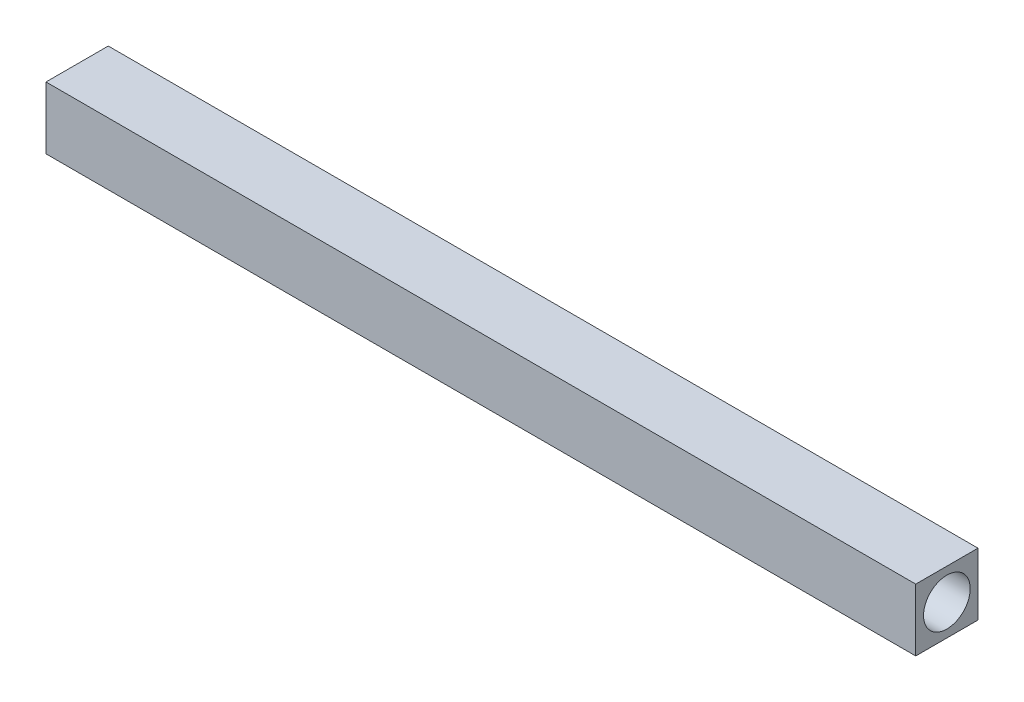
ISO-10303-21;
HEADER;
FILE_DESCRIPTION(('STEP AP214'),'2;1');
FILE_NAME('part.step','',(''),(''),'','','');
FILE_SCHEMA(('AUTOMOTIVE_DESIGN { 1 0 10303 214 1 1 1 1 }'));
ENDSEC;
DATA;
#1=APPLICATION_CONTEXT('core data for automotive mechanical design processes');
#2=APPLICATION_PROTOCOL_DEFINITION('international standard','automotive_design',2000,#1);
#3=PRODUCT_CONTEXT('',#1,'mechanical');
#4=PRODUCT('Part','Part','',(#3));
#5=PRODUCT_RELATED_PRODUCT_CATEGORY('part','',(#4));
#6=PRODUCT_DEFINITION_FORMATION('','',#4);
#7=PRODUCT_DEFINITION_CONTEXT('part definition',#1,'design');
#8=PRODUCT_DEFINITION('design','',#6,#7);
#9=PRODUCT_DEFINITION_SHAPE('','',#8);
#10=(LENGTH_UNIT() NAMED_UNIT(*) SI_UNIT(.MILLI.,.METRE.));
#11=(NAMED_UNIT(*) PLANE_ANGLE_UNIT() SI_UNIT($,.RADIAN.));
#12=(NAMED_UNIT(*) SI_UNIT($,.STERADIAN.) SOLID_ANGLE_UNIT());
#13=UNCERTAINTY_MEASURE_WITH_UNIT(LENGTH_MEASURE(1.E-05),#10,'distance_accuracy_value','');
#14=(GEOMETRIC_REPRESENTATION_CONTEXT(3) GLOBAL_UNCERTAINTY_ASSIGNED_CONTEXT((#13)) GLOBAL_UNIT_ASSIGNED_CONTEXT((#10,
#11,#12)) REPRESENTATION_CONTEXT('',''));
#15=CARTESIAN_POINT('',(0.,0.,0.));
#16=DIRECTION('',(0.,0.,1.));
#17=DIRECTION('',(1.,0.,0.));
#18=AXIS2_PLACEMENT_3D('',#15,#16,#17);
#19=CARTESIAN_POINT('',(279.4,0.,0.));
#20=DIRECTION('',(0.,0.,1.));
#21=DIRECTION('',(1.,0.,0.));
#22=AXIS2_PLACEMENT_3D('',#19,#20,#21);
#23=PLANE('',#22);
#24=DIRECTION('',(0.,1.,0.));
#25=VECTOR('',#24,1.);
#26=CARTESIAN_POINT('',(0.,0.,0.));
#27=LINE('',#26,#25);
#28=CARTESIAN_POINT('',(0.,0.,0.));
#29=VERTEX_POINT('',#28);
#30=CARTESIAN_POINT('',(0.,20.,0.));
#31=VERTEX_POINT('',#30);
#32=EDGE_CURVE('E99',#29,#31,#27,.T.);
#33=ORIENTED_EDGE('',*,*,#32,.T.);
#34=DIRECTION('',(-1.,0.,0.));
#35=VECTOR('',#34,1.);
#36=CARTESIAN_POINT('',(279.4,20.,0.));
#37=LINE('',#36,#35);
#38=CARTESIAN_POINT('',(279.4,20.,0.));
#39=VERTEX_POINT('',#38);
#40=EDGE_CURVE('E41',#39,#31,#37,.T.);
#41=ORIENTED_EDGE('',*,*,#40,.F.);
#42=DIRECTION('',(0.,1.,0.));
#43=VECTOR('',#42,1.);
#44=CARTESIAN_POINT('',(279.4,0.,0.));
#45=LINE('',#44,#43);
#46=CARTESIAN_POINT('',(279.4,0.,0.));
#47=VERTEX_POINT('',#46);
#48=EDGE_CURVE('E85',#47,#39,#45,.T.);
#49=ORIENTED_EDGE('',*,*,#48,.F.);
#50=DIRECTION('',(-1.,0.,0.));
#51=VECTOR('',#50,1.);
#52=CARTESIAN_POINT('',(279.4,0.,0.));
#53=LINE('',#52,#51);
#54=EDGE_CURVE('E95',#47,#29,#53,.T.);
#55=ORIENTED_EDGE('',*,*,#54,.T.);
#56=EDGE_LOOP('',(#33,#41,#49,#55));
#57=FACE_BOUND('',#56,.T.);
#58=CARTESIAN_POINT('',(10.,10.,0.));
#59=DIRECTION('',(0.,0.,1.));
#60=DIRECTION('',(1.,0.,0.));
#61=AXIS2_PLACEMENT_3D('',#58,#59,#60);
#62=CIRCLE('',#61,7.5);
#63=CARTESIAN_POINT('',(17.5,10.,0.));
#64=VERTEX_POINT('',#63);
#65=EDGE_CURVE('E11',#64,#64,#62,.F.);
#66=ORIENTED_EDGE('',*,*,#65,.F.);
#67=EDGE_LOOP('',(#66));
#68=FACE_BOUND('',#67,.T.);
#69=ADVANCED_FACE('F33',(#57,#68),#23,.F.);
#70=CARTESIAN_POINT('',(279.4,20.,0.));
#71=DIRECTION('',(0.,-1.,0.));
#72=DIRECTION('',(0.,0.,-1.));
#73=AXIS2_PLACEMENT_3D('',#70,#71,#72);
#74=PLANE('',#73);
#75=DIRECTION('',(0.,0.,1.));
#76=VECTOR('',#75,1.);
#77=CARTESIAN_POINT('',(0.,20.,0.));
#78=LINE('',#77,#76);
#79=CARTESIAN_POINT('',(0.,20.,20.));
#80=VERTEX_POINT('',#79);
#81=EDGE_CURVE('E90',#31,#80,#78,.T.);
#82=ORIENTED_EDGE('',*,*,#81,.T.);
#83=DIRECTION('',(-1.,0.,0.));
#84=VECTOR('',#83,1.);
#85=CARTESIAN_POINT('',(279.4,20.,20.));
#86=LINE('',#85,#84);
#87=CARTESIAN_POINT('',(279.4,20.,20.));
#88=VERTEX_POINT('',#87);
#89=EDGE_CURVE('E88',#88,#80,#86,.T.);
#90=ORIENTED_EDGE('',*,*,#89,.F.);
#91=DIRECTION('',(0.,0.,1.));
#92=VECTOR('',#91,1.);
#93=CARTESIAN_POINT('',(279.4,20.,0.));
#94=LINE('',#93,#92);
#95=EDGE_CURVE('E80',#39,#88,#94,.T.);
#96=ORIENTED_EDGE('',*,*,#95,.F.);
#97=ORIENTED_EDGE('',*,*,#40,.T.);
#98=EDGE_LOOP('',(#82,#90,#96,#97));
#99=FACE_BOUND('',#98,.T.);
#100=ADVANCED_FACE('F89',(#99),#74,.F.);
#101=CARTESIAN_POINT('',(279.4,0.,20.));
#102=DIRECTION('',(0.,0.,-1.));
#103=DIRECTION('',(-1.,0.,0.));
#104=AXIS2_PLACEMENT_3D('',#101,#102,#103);
#105=PLANE('',#104);
#106=DIRECTION('',(0.,-1.,0.));
#107=VECTOR('',#106,1.);
#108=CARTESIAN_POINT('',(0.,0.,20.));
#109=LINE('',#108,#107);
#110=CARTESIAN_POINT('',(0.,0.,20.));
#111=VERTEX_POINT('',#110);
#112=EDGE_CURVE('E66',#80,#111,#109,.T.);
#113=ORIENTED_EDGE('',*,*,#112,.T.);
#114=DIRECTION('',(-1.,0.,0.));
#115=VECTOR('',#114,1.);
#116=CARTESIAN_POINT('',(279.4,0.,20.));
#117=LINE('',#116,#115);
#118=CARTESIAN_POINT('',(279.4,0.,20.));
#119=VERTEX_POINT('',#118);
#120=EDGE_CURVE('E91',#119,#111,#117,.T.);
#121=ORIENTED_EDGE('',*,*,#120,.F.);
#122=DIRECTION('',(0.,-1.,0.));
#123=VECTOR('',#122,1.);
#124=CARTESIAN_POINT('',(279.4,0.,20.));
#125=LINE('',#124,#123);
#126=EDGE_CURVE('E83',#88,#119,#125,.T.);
#127=ORIENTED_EDGE('',*,*,#126,.F.);
#128=ORIENTED_EDGE('',*,*,#89,.T.);
#129=EDGE_LOOP('',(#113,#121,#127,#128));
#130=FACE_BOUND('',#129,.T.);
#131=ADVANCED_FACE('F93',(#130),#105,.F.);
#132=CARTESIAN_POINT('',(279.4,0.,0.));
#133=DIRECTION('',(0.,1.,0.));
#134=DIRECTION('',(0.,0.,1.));
#135=AXIS2_PLACEMENT_3D('',#132,#133,#134);
#136=PLANE('',#135);
#137=DIRECTION('',(0.,0.,-1.));
#138=VECTOR('',#137,1.);
#139=CARTESIAN_POINT('',(0.,0.,0.));
#140=LINE('',#139,#138);
#141=EDGE_CURVE('E72',#111,#29,#140,.T.);
#142=ORIENTED_EDGE('',*,*,#141,.T.);
#143=ORIENTED_EDGE('',*,*,#54,.F.);
#144=DIRECTION('',(0.,0.,-1.));
#145=VECTOR('',#144,1.);
#146=CARTESIAN_POINT('',(279.4,0.,0.));
#147=LINE('',#146,#145);
#148=EDGE_CURVE('E49',#119,#47,#147,.T.);
#149=ORIENTED_EDGE('',*,*,#148,.F.);
#150=ORIENTED_EDGE('',*,*,#120,.T.);
#151=EDGE_LOOP('',(#142,#143,#149,#150));
#152=FACE_BOUND('',#151,.T.);
#153=ADVANCED_FACE('F122',(#152),#136,.F.);
#154=CARTESIAN_POINT('',(279.4,20.,0.));
#155=DIRECTION('',(1.,0.,0.));
#156=DIRECTION('',(0.,0.,-1.));
#157=AXIS2_PLACEMENT_3D('',#154,#155,#156);
#158=PLANE('',#157);
#159=CARTESIAN_POINT('',(279.4,9.99999999999999,10.));
#160=DIRECTION('',(1.,0.,0.));
#161=DIRECTION('',(0.,0.,-1.));
#162=AXIS2_PLACEMENT_3D('',#159,#160,#161);
#163=CIRCLE('',#162,7.5);
#164=CARTESIAN_POINT('',(279.4,9.99999999999999,2.5));
#165=VERTEX_POINT('',#164);
#166=EDGE_CURVE('E184',#165,#165,#163,.T.);
#167=ORIENTED_EDGE('',*,*,#166,.F.);
#168=EDGE_LOOP('',(#167));
#169=FACE_BOUND('',#168,.T.);
#170=ORIENTED_EDGE('',*,*,#48,.T.);
#171=ORIENTED_EDGE('',*,*,#95,.T.);
#172=ORIENTED_EDGE('',*,*,#126,.T.);
#173=ORIENTED_EDGE('',*,*,#148,.T.);
#174=EDGE_LOOP('',(#170,#171,#172,#173));
#175=FACE_BOUND('',#174,.T.);
#176=ADVANCED_FACE('F81',(#169,#175),#158,.T.);
#177=CARTESIAN_POINT('',(0.,20.,0.));
#178=DIRECTION('',(1.,0.,0.));
#179=DIRECTION('',(0.,0.,-1.));
#180=AXIS2_PLACEMENT_3D('',#177,#178,#179);
#181=PLANE('',#180);
#182=ORIENTED_EDGE('',*,*,#32,.F.);
#183=ORIENTED_EDGE('',*,*,#141,.F.);
#184=ORIENTED_EDGE('',*,*,#112,.F.);
#185=ORIENTED_EDGE('',*,*,#81,.F.);
#186=EDGE_LOOP('',(#182,#183,#184,#185));
#187=FACE_BOUND('',#186,.T.);
#188=ADVANCED_FACE('F111',(#187),#181,.F.);
#189=CARTESIAN_POINT('',(10.,10.,-1.5));
#190=DIRECTION('',(0.,0.,1.));
#191=DIRECTION('',(1.,0.,0.));
#192=AXIS2_PLACEMENT_3D('',#189,#190,#191);
#193=CYLINDRICAL_SURFACE('',#192,7.5);
#194=CARTESIAN_POINT('',(10.,10.,-1.5));
#195=DIRECTION('',(0.,0.,-1.));
#196=DIRECTION('',(-1.,0.,0.));
#197=AXIS2_PLACEMENT_3D('',#194,#195,#196);
#198=CIRCLE('',#197,7.5);
#199=CARTESIAN_POINT('',(2.5,10.,-1.5));
#200=VERTEX_POINT('',#199);
#201=EDGE_CURVE('E102',#200,#200,#198,.T.);
#202=ORIENTED_EDGE('',*,*,#201,.F.);
#203=EDGE_LOOP('',(#202));
#204=FACE_BOUND('',#203,.T.);
#205=ORIENTED_EDGE('',*,*,#65,.T.);
#206=EDGE_LOOP('',(#205));
#207=FACE_BOUND('',#206,.T.);
#208=ADVANCED_FACE('F113',(#204,#207),#193,.T.);
#209=CARTESIAN_POINT('',(10.,10.,-1.5));
#210=DIRECTION('',(0.,0.,-1.));
#211=DIRECTION('',(-1.,0.,0.));
#212=AXIS2_PLACEMENT_3D('',#209,#210,#211);
#213=PLANE('',#212);
#214=ORIENTED_EDGE('',*,*,#201,.T.);
#215=EDGE_LOOP('',(#214));
#216=FACE_BOUND('',#215,.T.);
#217=ADVANCED_FACE('F119',(#216),#213,.T.);
#218=CARTESIAN_POINT('',(12.7,9.99999999999999,10.));
#219=DIRECTION('',(1.,0.,0.));
#220=DIRECTION('',(0.,0.,-1.));
#221=AXIS2_PLACEMENT_3D('',#218,#219,#220);
#222=CYLINDRICAL_SURFACE('',#221,7.5);
#223=CARTESIAN_POINT('',(12.7,9.99999999999999,10.));
#224=DIRECTION('',(1.,0.,0.));
#225=DIRECTION('',(0.,0.,-1.));
#226=AXIS2_PLACEMENT_3D('',#223,#224,#225);
#227=CIRCLE('',#226,7.5);
#228=CARTESIAN_POINT('',(12.7,9.99999999999999,2.5));
#229=VERTEX_POINT('',#228);
#230=EDGE_CURVE('E182',#229,#229,#227,.T.);
#231=ORIENTED_EDGE('',*,*,#230,.F.);
#232=EDGE_LOOP('',(#231));
#233=FACE_BOUND('',#232,.T.);
#234=ORIENTED_EDGE('',*,*,#166,.T.);
#235=EDGE_LOOP('',(#234));
#236=FACE_BOUND('',#235,.T.);
#237=ADVANCED_FACE('F154',(#233,#236),#222,.F.);
#238=CARTESIAN_POINT('',(12.7,10.,-12.1414213562373));
#239=DIRECTION('',(1.,0.,0.));
#240=DIRECTION('',(0.,0.,-1.));
#241=AXIS2_PLACEMENT_3D('',#238,#239,#240);
#242=PLANE('',#241);
#243=ORIENTED_EDGE('',*,*,#230,.T.);
#244=EDGE_LOOP('',(#243));
#245=FACE_BOUND('',#244,.T.);
#246=ADVANCED_FACE('F159',(#245),#242,.T.);
#247=CLOSED_SHELL('',(#69,#100,#131,#153,#176,#188,#208,#217,#237,#246));
#248=MANIFOLD_SOLID_BREP('B2',#247);
#249=ADVANCED_BREP_SHAPE_REPRESENTATION('',(#18,#248),#14);
#250=SHAPE_DEFINITION_REPRESENTATION(#9,#249);
ENDSEC;
END-ISO-10303-21;
